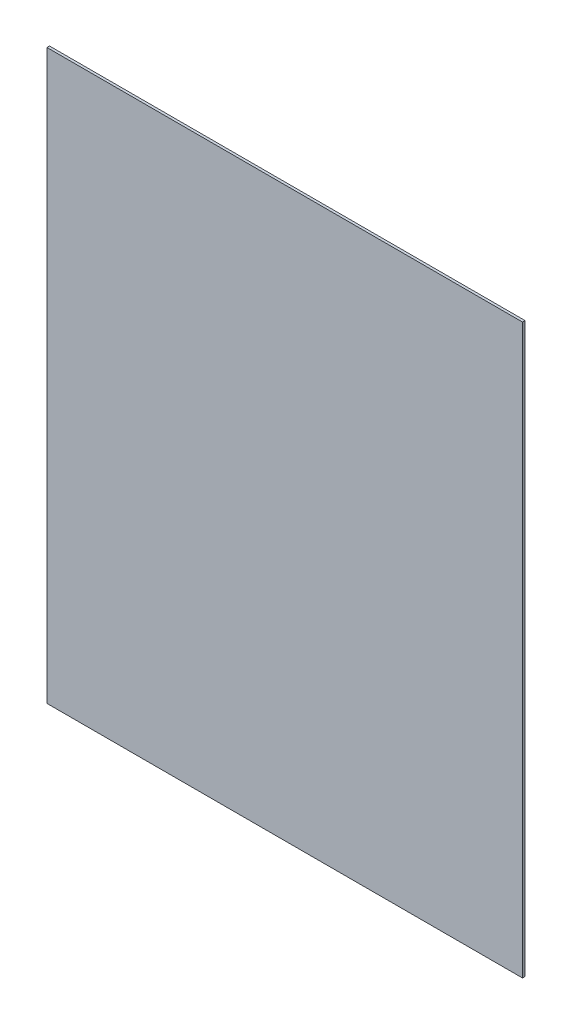
ISO-10303-21;
HEADER;
FILE_DESCRIPTION(('STEP AP214'),'2;1');
FILE_NAME('part.step','',(''),(''),'','','');
FILE_SCHEMA(('AUTOMOTIVE_DESIGN { 1 0 10303 214 1 1 1 1 }'));
ENDSEC;
DATA;
#1=APPLICATION_CONTEXT('core data for automotive mechanical design processes');
#2=APPLICATION_PROTOCOL_DEFINITION('international standard','automotive_design',2000,#1);
#3=PRODUCT_CONTEXT('',#1,'mechanical');
#4=PRODUCT('Part','Part','',(#3));
#5=PRODUCT_RELATED_PRODUCT_CATEGORY('part','',(#4));
#6=PRODUCT_DEFINITION_FORMATION('','',#4);
#7=PRODUCT_DEFINITION_CONTEXT('part definition',#1,'design');
#8=PRODUCT_DEFINITION('design','',#6,#7);
#9=PRODUCT_DEFINITION_SHAPE('','',#8);
#10=(LENGTH_UNIT() NAMED_UNIT(*) SI_UNIT(.MILLI.,.METRE.));
#11=(NAMED_UNIT(*) PLANE_ANGLE_UNIT() SI_UNIT($,.RADIAN.));
#12=(NAMED_UNIT(*) SI_UNIT($,.STERADIAN.) SOLID_ANGLE_UNIT());
#13=UNCERTAINTY_MEASURE_WITH_UNIT(LENGTH_MEASURE(1.E-05),#10,'distance_accuracy_value','');
#14=(GEOMETRIC_REPRESENTATION_CONTEXT(3) GLOBAL_UNCERTAINTY_ASSIGNED_CONTEXT((#13)) GLOBAL_UNIT_ASSIGNED_CONTEXT((#10,
#11,#12)) REPRESENTATION_CONTEXT('',''));
#15=CARTESIAN_POINT('',(0.,0.,0.));
#16=DIRECTION('',(0.,0.,1.));
#17=DIRECTION('',(1.,0.,0.));
#18=AXIS2_PLACEMENT_3D('',#15,#16,#17);
#19=CARTESIAN_POINT('',(-250.63,-176.17,-1.5875));
#20=DIRECTION('',(0.,-1.,0.));
#21=DIRECTION('',(0.,0.,-1.));
#22=AXIS2_PLACEMENT_3D('',#19,#20,#21);
#23=PLANE('',#22);
#24=DIRECTION('',(1.,0.,0.));
#25=VECTOR('',#24,1.);
#26=CARTESIAN_POINT('',(-250.63,-176.17,0.));
#27=LINE('',#26,#25);
#28=CARTESIAN_POINT('',(-44.3099999999999,-176.17,0.));
#29=VERTEX_POINT('',#28);
#30=CARTESIAN_POINT('',(250.63,-176.17,0.));
#31=VERTEX_POINT('',#30);
#32=EDGE_CURVE('E79',#29,#31,#27,.T.);
#33=ORIENTED_EDGE('',*,*,#32,.F.);
#34=DIRECTION('',(0.,0.,1.));
#35=VECTOR('',#34,1.);
#36=CARTESIAN_POINT('',(-44.3099999999999,-176.17,-10.));
#37=LINE('',#36,#35);
#38=CARTESIAN_POINT('',(-44.3099999999999,-176.17,-1.5875));
#39=VERTEX_POINT('',#38);
#40=EDGE_CURVE('E58',#39,#29,#37,.T.);
#41=ORIENTED_EDGE('',*,*,#40,.F.);
#42=DIRECTION('',(1.,0.,0.));
#43=VECTOR('',#42,1.);
#44=CARTESIAN_POINT('',(-250.63,-176.17,-1.5875));
#45=LINE('',#44,#43);
#46=CARTESIAN_POINT('',(250.63,-176.17,-1.5875));
#47=VERTEX_POINT('',#46);
#48=EDGE_CURVE('E65',#39,#47,#45,.T.);
#49=ORIENTED_EDGE('',*,*,#48,.T.);
#50=DIRECTION('',(0.,0.,1.));
#51=VECTOR('',#50,1.);
#52=CARTESIAN_POINT('',(250.63,-176.17,-1.5875));
#53=LINE('',#52,#51);
#54=EDGE_CURVE('E12',#47,#31,#53,.T.);
#55=ORIENTED_EDGE('',*,*,#54,.T.);
#56=EDGE_LOOP('',(#33,#41,#49,#55));
#57=FACE_BOUND('',#56,.T.);
#58=ADVANCED_FACE('F43',(#57),#23,.T.);
#59=CARTESIAN_POINT('',(-250.63,176.17,-1.5875));
#60=DIRECTION('',(0.,1.,0.));
#61=DIRECTION('',(0.,0.,1.));
#62=AXIS2_PLACEMENT_3D('',#59,#60,#61);
#63=PLANE('',#62);
#64=DIRECTION('',(-1.,0.,0.));
#65=VECTOR('',#64,1.);
#66=CARTESIAN_POINT('',(-250.63,176.17,-1.5875));
#67=LINE('',#66,#65);
#68=CARTESIAN_POINT('',(250.63,176.17,-1.5875));
#69=VERTEX_POINT('',#68);
#70=CARTESIAN_POINT('',(-44.31,176.17,-1.5875));
#71=VERTEX_POINT('',#70);
#72=EDGE_CURVE('E99',#69,#71,#67,.T.);
#73=ORIENTED_EDGE('',*,*,#72,.T.);
#74=DIRECTION('',(0.,0.,1.));
#75=VECTOR('',#74,1.);
#76=CARTESIAN_POINT('',(-44.31,176.17,-10.));
#77=LINE('',#76,#75);
#78=CARTESIAN_POINT('',(-44.31,176.17,0.));
#79=VERTEX_POINT('',#78);
#80=EDGE_CURVE('E103',#71,#79,#77,.T.);
#81=ORIENTED_EDGE('',*,*,#80,.T.);
#82=DIRECTION('',(-1.,0.,0.));
#83=VECTOR('',#82,1.);
#84=CARTESIAN_POINT('',(-250.63,176.17,0.));
#85=LINE('',#84,#83);
#86=CARTESIAN_POINT('',(250.63,176.17,0.));
#87=VERTEX_POINT('',#86);
#88=EDGE_CURVE('E86',#87,#79,#85,.T.);
#89=ORIENTED_EDGE('',*,*,#88,.F.);
#90=DIRECTION('',(0.,0.,1.));
#91=VECTOR('',#90,1.);
#92=CARTESIAN_POINT('',(250.63,176.17,-1.5875));
#93=LINE('',#92,#91);
#94=EDGE_CURVE('E47',#69,#87,#93,.T.);
#95=ORIENTED_EDGE('',*,*,#94,.F.);
#96=EDGE_LOOP('',(#73,#81,#89,#95));
#97=FACE_BOUND('',#96,.T.);
#98=ADVANCED_FACE('F110',(#97),#63,.T.);
#99=CARTESIAN_POINT('',(0.,0.,-1.5875));
#100=DIRECTION('',(0.,0.,-1.));
#101=DIRECTION('',(-1.,0.,0.));
#102=AXIS2_PLACEMENT_3D('',#99,#100,#101);
#103=PLANE('',#102);
#104=ORIENTED_EDGE('',*,*,#48,.F.);
#105=DIRECTION('',(0.,1.,0.));
#106=VECTOR('',#105,1.);
#107=CARTESIAN_POINT('',(-44.3099999999999,0.,-1.5875));
#108=LINE('',#107,#106);
#109=EDGE_CURVE('E92',#39,#71,#108,.T.);
#110=ORIENTED_EDGE('',*,*,#109,.T.);
#111=ORIENTED_EDGE('',*,*,#72,.F.);
#112=DIRECTION('',(0.,1.,0.));
#113=VECTOR('',#112,1.);
#114=CARTESIAN_POINT('',(250.63,-176.17,-1.5875));
#115=LINE('',#114,#113);
#116=EDGE_CURVE('E85',#47,#69,#115,.T.);
#117=ORIENTED_EDGE('',*,*,#116,.F.);
#118=EDGE_LOOP('',(#104,#110,#111,#117));
#119=FACE_BOUND('',#118,.T.);
#120=ADVANCED_FACE('F117',(#119),#103,.T.);
#121=CARTESIAN_POINT('',(0.,0.,0.));
#122=DIRECTION('',(0.,0.,-1.));
#123=DIRECTION('',(-1.,0.,0.));
#124=AXIS2_PLACEMENT_3D('',#121,#122,#123);
#125=PLANE('',#124);
#126=DIRECTION('',(0.,-1.,0.));
#127=VECTOR('',#126,1.);
#128=CARTESIAN_POINT('',(-44.3099999999999,0.,0.));
#129=LINE('',#128,#127);
#130=EDGE_CURVE('E84',#79,#29,#129,.T.);
#131=ORIENTED_EDGE('',*,*,#130,.T.);
#132=ORIENTED_EDGE('',*,*,#32,.T.);
#133=DIRECTION('',(0.,1.,0.));
#134=VECTOR('',#133,1.);
#135=CARTESIAN_POINT('',(250.63,-176.17,0.));
#136=LINE('',#135,#134);
#137=EDGE_CURVE('E83',#31,#87,#136,.T.);
#138=ORIENTED_EDGE('',*,*,#137,.T.);
#139=ORIENTED_EDGE('',*,*,#88,.T.);
#140=EDGE_LOOP('',(#131,#132,#138,#139));
#141=FACE_BOUND('',#140,.T.);
#142=ADVANCED_FACE('F80',(#141),#125,.F.);
#143=CARTESIAN_POINT('',(250.63,-176.17,-1.5875));
#144=DIRECTION('',(1.,0.,0.));
#145=DIRECTION('',(0.,0.,-1.));
#146=AXIS2_PLACEMENT_3D('',#143,#144,#145);
#147=PLANE('',#146);
#148=ORIENTED_EDGE('',*,*,#137,.F.);
#149=ORIENTED_EDGE('',*,*,#54,.F.);
#150=ORIENTED_EDGE('',*,*,#116,.T.);
#151=ORIENTED_EDGE('',*,*,#94,.T.);
#152=EDGE_LOOP('',(#148,#149,#150,#151));
#153=FACE_BOUND('',#152,.T.);
#154=ADVANCED_FACE('F45',(#153),#147,.T.);
#155=CARTESIAN_POINT('',(-44.3099999999999,0.,-10.));
#156=DIRECTION('',(-1.,0.,0.));
#157=DIRECTION('',(0.,-1.,0.));
#158=AXIS2_PLACEMENT_3D('',#155,#156,#157);
#159=PLANE('',#158);
#160=ORIENTED_EDGE('',*,*,#40,.T.);
#161=ORIENTED_EDGE('',*,*,#130,.F.);
#162=ORIENTED_EDGE('',*,*,#80,.F.);
#163=ORIENTED_EDGE('',*,*,#109,.F.);
#164=EDGE_LOOP('',(#160,#161,#162,#163));
#165=FACE_BOUND('',#164,.T.);
#166=ADVANCED_FACE('F114',(#165),#159,.T.);
#167=CLOSED_SHELL('',(#58,#98,#120,#142,#154,#166));
#168=MANIFOLD_SOLID_BREP('B2',#167);
#169=ADVANCED_BREP_SHAPE_REPRESENTATION('',(#18,#168),#14);
#170=SHAPE_DEFINITION_REPRESENTATION(#9,#169);
ENDSEC;
END-ISO-10303-21;
